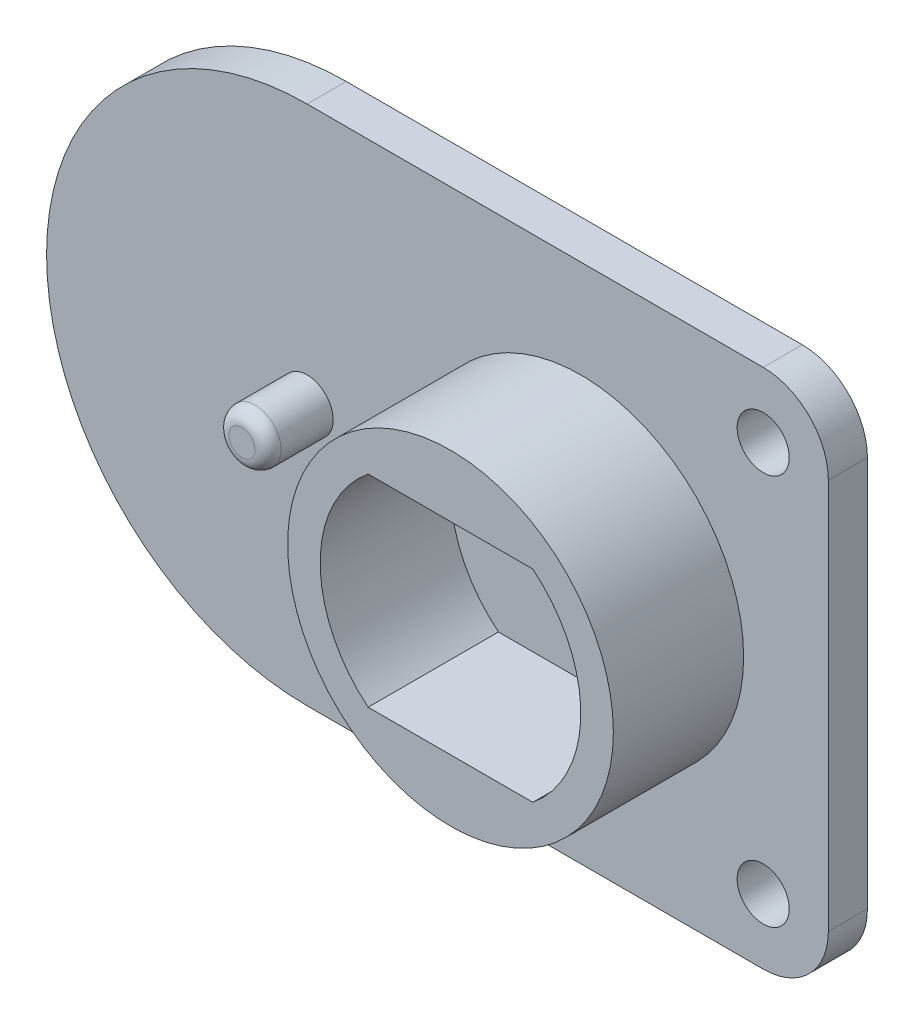
ISO-10303-21;
HEADER;
FILE_DESCRIPTION(('STEP AP214'),'2;1');
FILE_NAME('part.step','',(''),(''),'','','');
FILE_SCHEMA(('AUTOMOTIVE_DESIGN { 1 0 10303 214 1 1 1 1 }'));
ENDSEC;
DATA;
#1=APPLICATION_CONTEXT('core data for automotive mechanical design processes');
#2=APPLICATION_PROTOCOL_DEFINITION('international standard','automotive_design',2000,#1);
#3=PRODUCT_CONTEXT('',#1,'mechanical');
#4=PRODUCT('Part','Part','',(#3));
#5=PRODUCT_RELATED_PRODUCT_CATEGORY('part','',(#4));
#6=PRODUCT_DEFINITION_FORMATION('','',#4);
#7=PRODUCT_DEFINITION_CONTEXT('part definition',#1,'design');
#8=PRODUCT_DEFINITION('design','',#6,#7);
#9=PRODUCT_DEFINITION_SHAPE('','',#8);
#10=(LENGTH_UNIT() NAMED_UNIT(*) SI_UNIT(.MILLI.,.METRE.));
#11=(NAMED_UNIT(*) PLANE_ANGLE_UNIT() SI_UNIT($,.RADIAN.));
#12=(NAMED_UNIT(*) SI_UNIT($,.STERADIAN.) SOLID_ANGLE_UNIT());
#13=UNCERTAINTY_MEASURE_WITH_UNIT(LENGTH_MEASURE(1.E-05),#10,'distance_accuracy_value','');
#14=(GEOMETRIC_REPRESENTATION_CONTEXT(3) GLOBAL_UNCERTAINTY_ASSIGNED_CONTEXT((#13)) GLOBAL_UNIT_ASSIGNED_CONTEXT((#10,
#11,#12)) REPRESENTATION_CONTEXT('',''));
#15=CARTESIAN_POINT('',(0.,0.,0.));
#16=DIRECTION('',(0.,0.,1.));
#17=DIRECTION('',(1.,0.,0.));
#18=AXIS2_PLACEMENT_3D('',#15,#16,#17);
#19=CARTESIAN_POINT('',(0.,0.,3.));
#20=DIRECTION('',(0.,0.,1.));
#21=DIRECTION('',(1.,0.,0.));
#22=AXIS2_PLACEMENT_3D('',#19,#20,#21);
#23=PLANE('',#22);
#24=CARTESIAN_POINT('',(21.,0.,3.));
#25=DIRECTION('',(0.,0.,1.));
#26=DIRECTION('',(1.,0.,0.));
#27=AXIS2_PLACEMENT_3D('',#24,#25,#26);
#28=CIRCLE('',#27,3.5);
#29=CARTESIAN_POINT('',(24.5,0.,3.));
#30=VERTEX_POINT('',#29);
#31=EDGE_CURVE('E188',#30,#30,#28,.T.);
#32=ORIENTED_EDGE('',*,*,#31,.F.);
#33=EDGE_LOOP('',(#32));
#34=FACE_BOUND('',#33,.T.);
#35=CARTESIAN_POINT('',(21.0000000000004,6.18379329721488E-13,3.));
#36=DIRECTION('',(0.,0.,1.));
#37=DIRECTION('',(1.,0.,0.));
#38=AXIS2_PLACEMENT_3D('',#35,#36,#37);
#39=CIRCLE('',#38,10.0000000000005);
#40=CARTESIAN_POINT('',(27.3196123298821,-7.75000000000017,3.));
#41=VERTEX_POINT('',#40);
#42=CARTESIAN_POINT('',(27.3196123298824,7.75000000000054,3.));
#43=VERTEX_POINT('',#42);
#44=EDGE_CURVE('E132',#41,#43,#39,.T.);
#45=ORIENTED_EDGE('',*,*,#44,.T.);
#46=DIRECTION('',(1.,0.,0.));
#47=VECTOR('',#46,1.);
#48=CARTESIAN_POINT('',(0.,7.75,3.));
#49=LINE('',#48,#47);
#50=CARTESIAN_POINT('',(14.6803876701184,7.75,3.));
#51=VERTEX_POINT('',#50);
#52=EDGE_CURVE('E158',#51,#43,#49,.T.);
#53=ORIENTED_EDGE('',*,*,#52,.F.);
#54=CARTESIAN_POINT('',(14.6803876701188,-7.75000000000017,3.));
#55=VERTEX_POINT('',#54);
#56=EDGE_CURVE('E60',#51,#55,#39,.T.);
#57=ORIENTED_EDGE('',*,*,#56,.T.);
#58=DIRECTION('',(-1.,0.,0.));
#59=VECTOR('',#58,1.);
#60=CARTESIAN_POINT('',(0.,-7.75000000000001,3.));
#61=LINE('',#60,#59);
#62=EDGE_CURVE('E168',#41,#55,#61,.T.);
#63=ORIENTED_EDGE('',*,*,#62,.F.);
#64=EDGE_LOOP('',(#45,#53,#57,#63));
#65=FACE_BOUND('',#64,.T.);
#66=ADVANCED_FACE('F45',(#34,#65),#23,.T.);
#67=CARTESIAN_POINT('',(0.,-20.,3.));
#68=DIRECTION('',(0.,1.,0.));
#69=DIRECTION('',(0.,0.,1.));
#70=AXIS2_PLACEMENT_3D('',#67,#68,#69);
#71=PLANE('',#70);
#72=DIRECTION('',(1.,0.,0.));
#73=VECTOR('',#72,1.);
#74=CARTESIAN_POINT('',(0.,-20.,0.));
#75=LINE('',#74,#73);
#76=CARTESIAN_POINT('',(0.,-20.,0.));
#77=VERTEX_POINT('',#76);
#78=CARTESIAN_POINT('',(35.,-20.,0.));
#79=VERTEX_POINT('',#78);
#80=EDGE_CURVE('E136',#77,#79,#75,.T.);
#81=ORIENTED_EDGE('',*,*,#80,.T.);
#82=DIRECTION('',(0.,0.,-1.));
#83=VECTOR('',#82,1.);
#84=CARTESIAN_POINT('',(35.,-20.,3.));
#85=LINE('',#84,#83);
#86=CARTESIAN_POINT('',(35.,-20.,3.));
#87=VERTEX_POINT('',#86);
#88=EDGE_CURVE('E238',#79,#87,#85,.F.);
#89=ORIENTED_EDGE('',*,*,#88,.T.);
#90=DIRECTION('',(1.,0.,0.));
#91=VECTOR('',#90,1.);
#92=CARTESIAN_POINT('',(0.,-20.,3.));
#93=LINE('',#92,#91);
#94=CARTESIAN_POINT('',(0.,-20.,3.));
#95=VERTEX_POINT('',#94);
#96=EDGE_CURVE('E177',#95,#87,#93,.T.);
#97=ORIENTED_EDGE('',*,*,#96,.F.);
#98=DIRECTION('',(0.,0.,-1.));
#99=VECTOR('',#98,1.);
#100=CARTESIAN_POINT('',(0.,-20.,3.));
#101=LINE('',#100,#99);
#102=EDGE_CURVE('E199',#95,#77,#101,.T.);
#103=ORIENTED_EDGE('',*,*,#102,.T.);
#104=EDGE_LOOP('',(#81,#89,#97,#103));
#105=FACE_BOUND('',#104,.T.);
#106=ADVANCED_FACE('F262',(#105),#71,.F.);
#107=CARTESIAN_POINT('',(40.,0.,3.));
#108=DIRECTION('',(1.,0.,0.));
#109=DIRECTION('',(0.,0.,-1.));
#110=AXIS2_PLACEMENT_3D('',#107,#108,#109);
#111=PLANE('',#110);
#112=DIRECTION('',(0.,-1.,0.));
#113=VECTOR('',#112,1.);
#114=CARTESIAN_POINT('',(40.,0.,3.));
#115=LINE('',#114,#113);
#116=CARTESIAN_POINT('',(40.,15.,3.));
#117=VERTEX_POINT('',#116);
#118=CARTESIAN_POINT('',(40.,-15.,3.));
#119=VERTEX_POINT('',#118);
#120=EDGE_CURVE('E180',#117,#119,#115,.T.);
#121=ORIENTED_EDGE('',*,*,#120,.T.);
#122=DIRECTION('',(0.,0.,-1.));
#123=VECTOR('',#122,1.);
#124=CARTESIAN_POINT('',(40.,-15.,0.));
#125=LINE('',#124,#123);
#126=CARTESIAN_POINT('',(40.,-15.,0.));
#127=VERTEX_POINT('',#126);
#128=EDGE_CURVE('E230',#119,#127,#125,.T.);
#129=ORIENTED_EDGE('',*,*,#128,.T.);
#130=DIRECTION('',(0.,-1.,0.));
#131=VECTOR('',#130,1.);
#132=CARTESIAN_POINT('',(40.,0.,0.));
#133=LINE('',#132,#131);
#134=CARTESIAN_POINT('',(40.,15.,0.));
#135=VERTEX_POINT('',#134);
#136=EDGE_CURVE('E202',#135,#127,#133,.T.);
#137=ORIENTED_EDGE('',*,*,#136,.F.);
#138=DIRECTION('',(0.,0.,-1.));
#139=VECTOR('',#138,1.);
#140=CARTESIAN_POINT('',(40.,15.,3.));
#141=LINE('',#140,#139);
#142=EDGE_CURVE('E227',#135,#117,#141,.F.);
#143=ORIENTED_EDGE('',*,*,#142,.T.);
#144=EDGE_LOOP('',(#121,#129,#137,#143));
#145=FACE_BOUND('',#144,.T.);
#146=ADVANCED_FACE('F269',(#145),#111,.T.);
#147=CARTESIAN_POINT('',(0.,20.,3.));
#148=DIRECTION('',(0.,1.,0.));
#149=DIRECTION('',(0.,0.,1.));
#150=AXIS2_PLACEMENT_3D('',#147,#148,#149);
#151=PLANE('',#150);
#152=DIRECTION('',(1.,0.,0.));
#153=VECTOR('',#152,1.);
#154=CARTESIAN_POINT('',(0.,20.,3.));
#155=LINE('',#154,#153);
#156=CARTESIAN_POINT('',(0.,20.,3.));
#157=VERTEX_POINT('',#156);
#158=CARTESIAN_POINT('',(35.,20.,3.));
#159=VERTEX_POINT('',#158);
#160=EDGE_CURVE('E184',#157,#159,#155,.T.);
#161=ORIENTED_EDGE('',*,*,#160,.T.);
#162=DIRECTION('',(0.,0.,-1.));
#163=VECTOR('',#162,1.);
#164=CARTESIAN_POINT('',(35.,20.,3.));
#165=LINE('',#164,#163);
#166=CARTESIAN_POINT('',(35.,20.,0.));
#167=VERTEX_POINT('',#166);
#168=EDGE_CURVE('E244',#159,#167,#165,.T.);
#169=ORIENTED_EDGE('',*,*,#168,.T.);
#170=DIRECTION('',(1.,0.,0.));
#171=VECTOR('',#170,1.);
#172=CARTESIAN_POINT('',(0.,20.,0.));
#173=LINE('',#172,#171);
#174=CARTESIAN_POINT('',(0.,20.,0.));
#175=VERTEX_POINT('',#174);
#176=EDGE_CURVE('E206',#175,#167,#173,.T.);
#177=ORIENTED_EDGE('',*,*,#176,.F.);
#178=DIRECTION('',(0.,0.,-1.));
#179=VECTOR('',#178,1.);
#180=CARTESIAN_POINT('',(0.,20.,3.));
#181=LINE('',#180,#179);
#182=EDGE_CURVE('E225',#157,#175,#181,.T.);
#183=ORIENTED_EDGE('',*,*,#182,.F.);
#184=EDGE_LOOP('',(#161,#169,#177,#183));
#185=FACE_BOUND('',#184,.T.);
#186=ADVANCED_FACE('F308',(#185),#151,.T.);
#187=CARTESIAN_POINT('',(35.,-15.,3.));
#188=DIRECTION('',(0.,0.,-1.));
#189=DIRECTION('',(-1.,0.,0.));
#190=AXIS2_PLACEMENT_3D('',#187,#188,#189);
#191=CYLINDRICAL_SURFACE('',#190,2.);
#192=CARTESIAN_POINT('',(35.,-15.,3.));
#193=DIRECTION('',(0.,0.,1.));
#194=DIRECTION('',(1.,0.,0.));
#195=AXIS2_PLACEMENT_3D('',#192,#193,#194);
#196=CIRCLE('',#195,2.);
#197=CARTESIAN_POINT('',(37.,-15.,3.));
#198=VERTEX_POINT('',#197);
#199=EDGE_CURVE('E192',#198,#198,#196,.T.);
#200=ORIENTED_EDGE('',*,*,#199,.T.);
#201=EDGE_LOOP('',(#200));
#202=FACE_BOUND('',#201,.T.);
#203=CARTESIAN_POINT('',(35.,-15.,0.));
#204=DIRECTION('',(0.,0.,1.));
#205=DIRECTION('',(1.,0.,0.));
#206=AXIS2_PLACEMENT_3D('',#203,#204,#205);
#207=CIRCLE('',#206,2.);
#208=CARTESIAN_POINT('',(37.,-15.,0.));
#209=VERTEX_POINT('',#208);
#210=EDGE_CURVE('E217',#209,#209,#207,.T.);
#211=ORIENTED_EDGE('',*,*,#210,.F.);
#212=EDGE_LOOP('',(#211));
#213=FACE_BOUND('',#212,.T.);
#214=ADVANCED_FACE('F304',(#202,#213),#191,.F.);
#215=CARTESIAN_POINT('',(0.,0.,3.));
#216=DIRECTION('',(0.,0.,-1.));
#217=DIRECTION('',(-1.,0.,0.));
#218=AXIS2_PLACEMENT_3D('',#215,#216,#217);
#219=CYLINDRICAL_SURFACE('',#218,1.);
#220=CARTESIAN_POINT('',(0.,0.,3.));
#221=DIRECTION('',(0.,0.,1.));
#222=DIRECTION('',(1.,0.,0.));
#223=AXIS2_PLACEMENT_3D('',#220,#221,#222);
#224=CIRCLE('',#223,1.);
#225=CARTESIAN_POINT('',(1.,0.,3.));
#226=VERTEX_POINT('',#225);
#227=EDGE_CURVE('E169',#226,#226,#224,.T.);
#228=ORIENTED_EDGE('',*,*,#227,.T.);
#229=EDGE_LOOP('',(#228));
#230=FACE_BOUND('',#229,.T.);
#231=CARTESIAN_POINT('',(0.,0.,0.));
#232=DIRECTION('',(0.,0.,1.));
#233=DIRECTION('',(1.,0.,0.));
#234=AXIS2_PLACEMENT_3D('',#231,#232,#233);
#235=CIRCLE('',#234,1.);
#236=CARTESIAN_POINT('',(1.,0.,0.));
#237=VERTEX_POINT('',#236);
#238=EDGE_CURVE('E214',#237,#237,#235,.T.);
#239=ORIENTED_EDGE('',*,*,#238,.F.);
#240=EDGE_LOOP('',(#239));
#241=FACE_BOUND('',#240,.T.);
#242=ADVANCED_FACE('F307',(#230,#241),#219,.F.);
#243=CARTESIAN_POINT('',(21.,0.,3.));
#244=DIRECTION('',(0.,0.,-1.));
#245=DIRECTION('',(-1.,0.,0.));
#246=AXIS2_PLACEMENT_3D('',#243,#244,#245);
#247=CYLINDRICAL_SURFACE('',#246,3.5);
#248=ORIENTED_EDGE('',*,*,#31,.T.);
#249=EDGE_LOOP('',(#248));
#250=FACE_BOUND('',#249,.T.);
#251=CARTESIAN_POINT('',(21.,0.,0.));
#252=DIRECTION('',(0.,0.,1.));
#253=DIRECTION('',(1.,0.,0.));
#254=AXIS2_PLACEMENT_3D('',#251,#252,#253);
#255=CIRCLE('',#254,3.5);
#256=CARTESIAN_POINT('',(24.5,0.,0.));
#257=VERTEX_POINT('',#256);
#258=EDGE_CURVE('E211',#257,#257,#255,.T.);
#259=ORIENTED_EDGE('',*,*,#258,.F.);
#260=EDGE_LOOP('',(#259));
#261=FACE_BOUND('',#260,.T.);
#262=ADVANCED_FACE('F316',(#250,#261),#247,.F.);
#263=CARTESIAN_POINT('',(0.,0.,3.));
#264=DIRECTION('',(0.,0.,-1.));
#265=DIRECTION('',(-1.,0.,0.));
#266=AXIS2_PLACEMENT_3D('',#263,#264,#265);
#267=CYLINDRICAL_SURFACE('',#266,20.);
#268=CARTESIAN_POINT('',(0.,0.,0.));
#269=DIRECTION('',(0.,0.,1.));
#270=DIRECTION('',(1.,0.,0.));
#271=AXIS2_PLACEMENT_3D('',#268,#269,#270);
#272=CIRCLE('',#271,20.);
#273=EDGE_CURVE('E209',#175,#77,#272,.T.);
#274=ORIENTED_EDGE('',*,*,#273,.T.);
#275=ORIENTED_EDGE('',*,*,#102,.F.);
#276=CARTESIAN_POINT('',(0.,0.,3.));
#277=DIRECTION('',(0.,0.,1.));
#278=DIRECTION('',(1.,0.,0.));
#279=AXIS2_PLACEMENT_3D('',#276,#277,#278);
#280=CIRCLE('',#279,20.);
#281=EDGE_CURVE('E186',#157,#95,#280,.T.);
#282=ORIENTED_EDGE('',*,*,#281,.F.);
#283=ORIENTED_EDGE('',*,*,#182,.T.);
#284=EDGE_LOOP('',(#274,#275,#282,#283));
#285=FACE_BOUND('',#284,.T.);
#286=ADVANCED_FACE('F286',(#285),#267,.T.);
#287=CARTESIAN_POINT('',(35.,15.,3.));
#288=DIRECTION('',(0.,0.,-1.));
#289=DIRECTION('',(-1.,0.,0.));
#290=AXIS2_PLACEMENT_3D('',#287,#288,#289);
#291=CYLINDRICAL_SURFACE('',#290,2.);
#292=CARTESIAN_POINT('',(35.,15.,3.));
#293=DIRECTION('',(0.,0.,1.));
#294=DIRECTION('',(1.,0.,0.));
#295=AXIS2_PLACEMENT_3D('',#292,#293,#294);
#296=CIRCLE('',#295,2.);
#297=CARTESIAN_POINT('',(37.,15.,3.));
#298=VERTEX_POINT('',#297);
#299=EDGE_CURVE('E195',#298,#298,#296,.F.);
#300=ORIENTED_EDGE('',*,*,#299,.F.);
#301=EDGE_LOOP('',(#300));
#302=FACE_BOUND('',#301,.T.);
#303=CARTESIAN_POINT('',(35.,15.,0.));
#304=DIRECTION('',(0.,0.,1.));
#305=DIRECTION('',(1.,0.,0.));
#306=AXIS2_PLACEMENT_3D('',#303,#304,#305);
#307=CIRCLE('',#306,2.);
#308=CARTESIAN_POINT('',(37.,15.,0.));
#309=VERTEX_POINT('',#308);
#310=EDGE_CURVE('E181',#309,#309,#307,.F.);
#311=ORIENTED_EDGE('',*,*,#310,.T.);
#312=EDGE_LOOP('',(#311));
#313=FACE_BOUND('',#312,.T.);
#314=ADVANCED_FACE('F278',(#302,#313),#291,.F.);
#315=CARTESIAN_POINT('',(1.29768314489452E-13,1.24768498273729E-12,3.));
#316=DIRECTION('',(0.,0.,1.));
#317=DIRECTION('',(1.,0.,0.));
#318=AXIS2_PLACEMENT_3D('',#315,#316,#317);
#319=CIRCLE('',#318,1.99999999999931);
#320=CARTESIAN_POINT('',(1.99999999999944,1.24768498273729E-12,3.));
#321=VERTEX_POINT('',#320);
#322=EDGE_CURVE('E292',#321,#321,#319,.T.);
#323=ORIENTED_EDGE('',*,*,#322,.F.);
#324=EDGE_LOOP('',(#323));
#325=FACE_BOUND('',#324,.T.);
#326=CARTESIAN_POINT('',(21.0000000000004,6.18379329721488E-13,3.));
#327=DIRECTION('',(0.,0.,1.));
#328=DIRECTION('',(1.,0.,0.));
#329=AXIS2_PLACEMENT_3D('',#326,#327,#328);
#330=CIRCLE('',#329,12.5000000000005);
#331=CARTESIAN_POINT('',(33.5000000000009,6.18379329721488E-13,3.));
#332=VERTEX_POINT('',#331);
#333=EDGE_CURVE('E153',#332,#332,#330,.T.);
#334=ORIENTED_EDGE('',*,*,#333,.F.);
#335=EDGE_LOOP('',(#334));
#336=FACE_BOUND('',#335,.T.);
#337=ORIENTED_EDGE('',*,*,#96,.T.);
#338=CARTESIAN_POINT('',(35.,-15.,3.));
#339=DIRECTION('',(0.,0.,1.));
#340=DIRECTION('',(1.,0.,0.));
#341=AXIS2_PLACEMENT_3D('',#338,#339,#340);
#342=CIRCLE('',#341,5.);
#343=EDGE_CURVE('E242',#87,#119,#342,.T.);
#344=ORIENTED_EDGE('',*,*,#343,.T.);
#345=ORIENTED_EDGE('',*,*,#120,.F.);
#346=CARTESIAN_POINT('',(35.,15.,3.));
#347=DIRECTION('',(0.,0.,1.));
#348=DIRECTION('',(1.,0.,0.));
#349=AXIS2_PLACEMENT_3D('',#346,#347,#348);
#350=CIRCLE('',#349,5.);
#351=EDGE_CURVE('E68',#117,#159,#350,.T.);
#352=ORIENTED_EDGE('',*,*,#351,.T.);
#353=ORIENTED_EDGE('',*,*,#160,.F.);
#354=ORIENTED_EDGE('',*,*,#281,.T.);
#355=EDGE_LOOP('',(#337,#344,#345,#352,#353,#354));
#356=FACE_BOUND('',#355,.T.);
#357=ORIENTED_EDGE('',*,*,#199,.F.);
#358=EDGE_LOOP('',(#357));
#359=FACE_BOUND('',#358,.T.);
#360=ORIENTED_EDGE('',*,*,#299,.T.);
#361=EDGE_LOOP('',(#360));
#362=FACE_BOUND('',#361,.T.);
#363=ADVANCED_FACE('F265',(#325,#336,#356,#359,#362),#23,.T.);
#364=CARTESIAN_POINT('',(0.,0.,0.));
#365=DIRECTION('',(0.,0.,1.));
#366=DIRECTION('',(1.,0.,0.));
#367=AXIS2_PLACEMENT_3D('',#364,#365,#366);
#368=PLANE('',#367);
#369=ORIENTED_EDGE('',*,*,#136,.T.);
#370=CARTESIAN_POINT('',(35.,-15.,0.));
#371=DIRECTION('',(0.,0.,1.));
#372=DIRECTION('',(1.,0.,0.));
#373=AXIS2_PLACEMENT_3D('',#370,#371,#372);
#374=CIRCLE('',#373,5.);
#375=EDGE_CURVE('E236',#127,#79,#374,.F.);
#376=ORIENTED_EDGE('',*,*,#375,.T.);
#377=ORIENTED_EDGE('',*,*,#80,.F.);
#378=ORIENTED_EDGE('',*,*,#273,.F.);
#379=ORIENTED_EDGE('',*,*,#176,.T.);
#380=CARTESIAN_POINT('',(35.,15.,0.));
#381=DIRECTION('',(0.,0.,1.));
#382=DIRECTION('',(1.,0.,0.));
#383=AXIS2_PLACEMENT_3D('',#380,#381,#382);
#384=CIRCLE('',#383,5.);
#385=EDGE_CURVE('E233',#167,#135,#384,.F.);
#386=ORIENTED_EDGE('',*,*,#385,.T.);
#387=EDGE_LOOP('',(#369,#376,#377,#378,#379,#386));
#388=FACE_BOUND('',#387,.T.);
#389=ORIENTED_EDGE('',*,*,#258,.T.);
#390=EDGE_LOOP('',(#389));
#391=FACE_BOUND('',#390,.T.);
#392=ORIENTED_EDGE('',*,*,#238,.T.);
#393=EDGE_LOOP('',(#392));
#394=FACE_BOUND('',#393,.T.);
#395=ORIENTED_EDGE('',*,*,#210,.T.);
#396=EDGE_LOOP('',(#395));
#397=FACE_BOUND('',#396,.T.);
#398=ORIENTED_EDGE('',*,*,#310,.F.);
#399=EDGE_LOOP('',(#398));
#400=FACE_BOUND('',#399,.T.);
#401=ADVANCED_FACE('F277',(#388,#391,#394,#397,#400),#368,.F.);
#402=CARTESIAN_POINT('',(35.,-15.,3.));
#403=DIRECTION('',(0.,0.,1.));
#404=DIRECTION('',(1.,0.,0.));
#405=AXIS2_PLACEMENT_3D('',#402,#403,#404);
#406=CYLINDRICAL_SURFACE('',#405,5.);
#407=ORIENTED_EDGE('',*,*,#343,.F.);
#408=ORIENTED_EDGE('',*,*,#88,.F.);
#409=ORIENTED_EDGE('',*,*,#375,.F.);
#410=ORIENTED_EDGE('',*,*,#128,.F.);
#411=EDGE_LOOP('',(#407,#408,#409,#410));
#412=FACE_BOUND('',#411,.T.);
#413=ADVANCED_FACE('F284',(#412),#406,.T.);
#414=CARTESIAN_POINT('',(35.,15.,3.));
#415=DIRECTION('',(0.,0.,-1.));
#416=DIRECTION('',(-1.,0.,0.));
#417=AXIS2_PLACEMENT_3D('',#414,#415,#416);
#418=CYLINDRICAL_SURFACE('',#417,5.);
#419=ORIENTED_EDGE('',*,*,#351,.F.);
#420=ORIENTED_EDGE('',*,*,#142,.F.);
#421=ORIENTED_EDGE('',*,*,#385,.F.);
#422=ORIENTED_EDGE('',*,*,#168,.F.);
#423=EDGE_LOOP('',(#419,#420,#421,#422));
#424=FACE_BOUND('',#423,.T.);
#425=ADVANCED_FACE('F332',(#424),#418,.T.);
#426=CARTESIAN_POINT('',(21.0000000000004,6.18379329721488E-13,13.));
#427=DIRECTION('',(0.,0.,-1.));
#428=DIRECTION('',(-1.,0.,0.));
#429=AXIS2_PLACEMENT_3D('',#426,#427,#428);
#430=CYLINDRICAL_SURFACE('',#429,10.0000000000005);
#431=ORIENTED_EDGE('',*,*,#44,.F.);
#432=DIRECTION('',(0.,0.,-1.));
#433=VECTOR('',#432,1.);
#434=CARTESIAN_POINT('',(27.3196123298821,-7.75000000000017,13.));
#435=LINE('',#434,#433);
#436=CARTESIAN_POINT('',(27.3196123298821,-7.75000000000017,13.));
#437=VERTEX_POINT('',#436);
#438=EDGE_CURVE('E126',#437,#41,#435,.T.);
#439=ORIENTED_EDGE('',*,*,#438,.F.);
#440=CARTESIAN_POINT('',(21.0000000000004,6.18379329721488E-13,13.));
#441=DIRECTION('',(0.,0.,1.));
#442=DIRECTION('',(1.,0.,0.));
#443=AXIS2_PLACEMENT_3D('',#440,#441,#442);
#444=CIRCLE('',#443,10.0000000000005);
#445=CARTESIAN_POINT('',(27.3196123298824,7.75000000000054,13.));
#446=VERTEX_POINT('',#445);
#447=EDGE_CURVE('E130',#437,#446,#444,.T.);
#448=ORIENTED_EDGE('',*,*,#447,.T.);
#449=DIRECTION('',(0.,0.,-1.));
#450=VECTOR('',#449,1.);
#451=CARTESIAN_POINT('',(27.3196123298824,7.75000000000054,13.));
#452=LINE('',#451,#450);
#453=EDGE_CURVE('E164',#446,#43,#452,.T.);
#454=ORIENTED_EDGE('',*,*,#453,.T.);
#455=EDGE_LOOP('',(#431,#439,#448,#454));
#456=FACE_BOUND('',#455,.T.);
#457=ADVANCED_FACE('F128',(#456),#430,.F.);
#458=CARTESIAN_POINT('',(0.,-7.75000000000001,13.));
#459=DIRECTION('',(0.,-1.,0.));
#460=DIRECTION('',(1.,0.,0.));
#461=AXIS2_PLACEMENT_3D('',#458,#459,#460);
#462=PLANE('',#461);
#463=ORIENTED_EDGE('',*,*,#62,.T.);
#464=DIRECTION('',(0.,0.,-1.));
#465=VECTOR('',#464,1.);
#466=CARTESIAN_POINT('',(14.6803876701188,-7.75000000000017,13.));
#467=LINE('',#466,#465);
#468=CARTESIAN_POINT('',(14.6803876701188,-7.75000000000017,13.));
#469=VERTEX_POINT('',#468);
#470=EDGE_CURVE('E137',#469,#55,#467,.T.);
#471=ORIENTED_EDGE('',*,*,#470,.F.);
#472=DIRECTION('',(-1.,0.,0.));
#473=VECTOR('',#472,1.);
#474=CARTESIAN_POINT('',(0.,-7.75000000000001,13.));
#475=LINE('',#474,#473);
#476=EDGE_CURVE('E140',#437,#469,#475,.T.);
#477=ORIENTED_EDGE('',*,*,#476,.F.);
#478=ORIENTED_EDGE('',*,*,#438,.T.);
#479=EDGE_LOOP('',(#463,#471,#477,#478));
#480=FACE_BOUND('',#479,.T.);
#481=ADVANCED_FACE('F141',(#480),#462,.F.);
#482=ORIENTED_EDGE('',*,*,#56,.F.);
#483=DIRECTION('',(0.,0.,-1.));
#484=VECTOR('',#483,1.);
#485=CARTESIAN_POINT('',(14.6803876701184,7.75000000000054,13.));
#486=LINE('',#485,#484);
#487=CARTESIAN_POINT('',(14.6803876701184,7.75000000000054,13.));
#488=VERTEX_POINT('',#487);
#489=EDGE_CURVE('E174',#488,#51,#486,.T.);
#490=ORIENTED_EDGE('',*,*,#489,.F.);
#491=EDGE_CURVE('E145',#488,#469,#444,.T.);
#492=ORIENTED_EDGE('',*,*,#491,.T.);
#493=ORIENTED_EDGE('',*,*,#470,.T.);
#494=EDGE_LOOP('',(#482,#490,#492,#493));
#495=FACE_BOUND('',#494,.T.);
#496=ADVANCED_FACE('F340',(#495),#430,.F.);
#497=CARTESIAN_POINT('',(0.,7.75,13.));
#498=DIRECTION('',(0.,1.,0.));
#499=DIRECTION('',(0.,0.,1.));
#500=AXIS2_PLACEMENT_3D('',#497,#498,#499);
#501=PLANE('',#500);
#502=ORIENTED_EDGE('',*,*,#52,.T.);
#503=ORIENTED_EDGE('',*,*,#453,.F.);
#504=DIRECTION('',(1.,0.,0.));
#505=VECTOR('',#504,1.);
#506=CARTESIAN_POINT('',(0.,7.75,13.));
#507=LINE('',#506,#505);
#508=EDGE_CURVE('E150',#488,#446,#507,.T.);
#509=ORIENTED_EDGE('',*,*,#508,.F.);
#510=ORIENTED_EDGE('',*,*,#489,.T.);
#511=EDGE_LOOP('',(#502,#503,#509,#510));
#512=FACE_BOUND('',#511,.T.);
#513=ADVANCED_FACE('F362',(#512),#501,.F.);
#514=CARTESIAN_POINT('',(21.0000000000004,6.18379329721488E-13,13.));
#515=DIRECTION('',(0.,0.,-1.));
#516=DIRECTION('',(-1.,0.,0.));
#517=AXIS2_PLACEMENT_3D('',#514,#515,#516);
#518=CYLINDRICAL_SURFACE('',#517,12.5000000000005);
#519=CARTESIAN_POINT('',(21.0000000000004,6.18379329721488E-13,13.));
#520=DIRECTION('',(0.,0.,1.));
#521=DIRECTION('',(1.,0.,0.));
#522=AXIS2_PLACEMENT_3D('',#519,#520,#521);
#523=CIRCLE('',#522,12.5000000000005);
#524=CARTESIAN_POINT('',(33.5000000000009,6.18379329721488E-13,13.));
#525=VERTEX_POINT('',#524);
#526=EDGE_CURVE('E161',#525,#525,#523,.T.);
#527=ORIENTED_EDGE('',*,*,#526,.F.);
#528=EDGE_LOOP('',(#527));
#529=FACE_BOUND('',#528,.T.);
#530=ORIENTED_EDGE('',*,*,#333,.T.);
#531=EDGE_LOOP('',(#530));
#532=FACE_BOUND('',#531,.T.);
#533=ADVANCED_FACE('F366',(#529,#532),#518,.T.);
#534=CARTESIAN_POINT('',(0.,0.,13.));
#535=DIRECTION('',(0.,0.,1.));
#536=DIRECTION('',(1.,0.,0.));
#537=AXIS2_PLACEMENT_3D('',#534,#535,#536);
#538=PLANE('',#537);
#539=ORIENTED_EDGE('',*,*,#447,.F.);
#540=ORIENTED_EDGE('',*,*,#476,.T.);
#541=ORIENTED_EDGE('',*,*,#491,.F.);
#542=ORIENTED_EDGE('',*,*,#508,.T.);
#543=EDGE_LOOP('',(#539,#540,#541,#542));
#544=FACE_BOUND('',#543,.T.);
#545=ORIENTED_EDGE('',*,*,#526,.T.);
#546=EDGE_LOOP('',(#545));
#547=FACE_BOUND('',#546,.T.);
#548=ADVANCED_FACE('F147',(#544,#547),#538,.T.);
#549=CARTESIAN_POINT('',(1.29768314489452E-13,1.24768498273729E-12,8.));
#550=DIRECTION('',(0.,0.,1.));
#551=DIRECTION('',(1.,0.,0.));
#552=AXIS2_PLACEMENT_3D('',#549,#550,#551);
#553=PLANE('',#552);
#554=CARTESIAN_POINT('',(1.29768314489452E-13,1.24768498273729E-12,8.));
#555=DIRECTION('',(0.,0.,1.));
#556=DIRECTION('',(1.,0.,0.));
#557=AXIS2_PLACEMENT_3D('',#554,#555,#556);
#558=CIRCLE('',#557,0.999999999999314);
#559=CARTESIAN_POINT('',(0.999999999999444,1.24768498273729E-12,8.));
#560=VERTEX_POINT('',#559);
#561=EDGE_CURVE('E53',#560,#560,#558,.T.);
#562=ORIENTED_EDGE('',*,*,#561,.T.);
#563=EDGE_LOOP('',(#562));
#564=FACE_BOUND('',#563,.T.);
#565=ADVANCED_FACE('F249',(#564),#553,.T.);
#566=CARTESIAN_POINT('',(1.29768314489452E-13,1.24768498273729E-12,8.));
#567=DIRECTION('',(0.,0.,-1.));
#568=DIRECTION('',(-1.,0.,0.));
#569=AXIS2_PLACEMENT_3D('',#566,#567,#568);
#570=CYLINDRICAL_SURFACE('',#569,1.99999999999931);
#571=CARTESIAN_POINT('',(1.29768314489452E-13,1.24768498273729E-12,7.));
#572=DIRECTION('',(0.,0.,1.));
#573=DIRECTION('',(1.,0.,0.));
#574=AXIS2_PLACEMENT_3D('',#571,#572,#573);
#575=CIRCLE('',#574,1.99999999999931);
#576=CARTESIAN_POINT('',(1.99999999999944,1.24768498273729E-12,7.));
#577=VERTEX_POINT('',#576);
#578=EDGE_CURVE('E11',#577,#577,#575,.F.);
#579=ORIENTED_EDGE('',*,*,#578,.T.);
#580=EDGE_LOOP('',(#579));
#581=FACE_BOUND('',#580,.T.);
#582=ORIENTED_EDGE('',*,*,#322,.T.);
#583=EDGE_LOOP('',(#582));
#584=FACE_BOUND('',#583,.T.);
#585=ADVANCED_FACE('F257',(#581,#584),#570,.T.);
#586=CARTESIAN_POINT('',(1.29768314489452E-13,1.24768498273729E-12,3.));
#587=DIRECTION('',(0.,0.,1.));
#588=DIRECTION('',(1.,0.,0.));
#589=AXIS2_PLACEMENT_3D('',#586,#587,#588);
#590=PLANE('',#589);
#591=ORIENTED_EDGE('',*,*,#227,.F.);
#592=EDGE_LOOP('',(#591));
#593=FACE_BOUND('',#592,.T.);
#594=ADVANCED_FACE('F252',(#593),#590,.F.);
#595=CARTESIAN_POINT('',(1.29768314489452E-13,1.24768498273729E-12,7.));
#596=DIRECTION('',(0.,0.,1.));
#597=DIRECTION('',(1.,0.,0.));
#598=AXIS2_PLACEMENT_3D('',#595,#596,#597);
#599=DEGENERATE_TOROIDAL_SURFACE('',#598,0.999999999999314,1.,.T.);
#600=ORIENTED_EDGE('',*,*,#578,.F.);
#601=EDGE_LOOP('',(#600));
#602=FACE_BOUND('',#601,.T.);
#603=ORIENTED_EDGE('',*,*,#561,.F.);
#604=EDGE_LOOP('',(#603));
#605=FACE_BOUND('',#604,.T.);
#606=ADVANCED_FACE('F47',(#602,#605),#599,.T.);
#607=CLOSED_SHELL('',(#66,#106,#146,#186,#214,#242,#262,#286,#314,#363,#401,#413,#425,#457,#481,
#496,#513,#533,#548,#565,#585,#594,#606));
#608=MANIFOLD_SOLID_BREP('B2',#607);
#609=ADVANCED_BREP_SHAPE_REPRESENTATION('',(#18,#608),#14);
#610=SHAPE_DEFINITION_REPRESENTATION(#9,#609);
ENDSEC;
END-ISO-10303-21;
